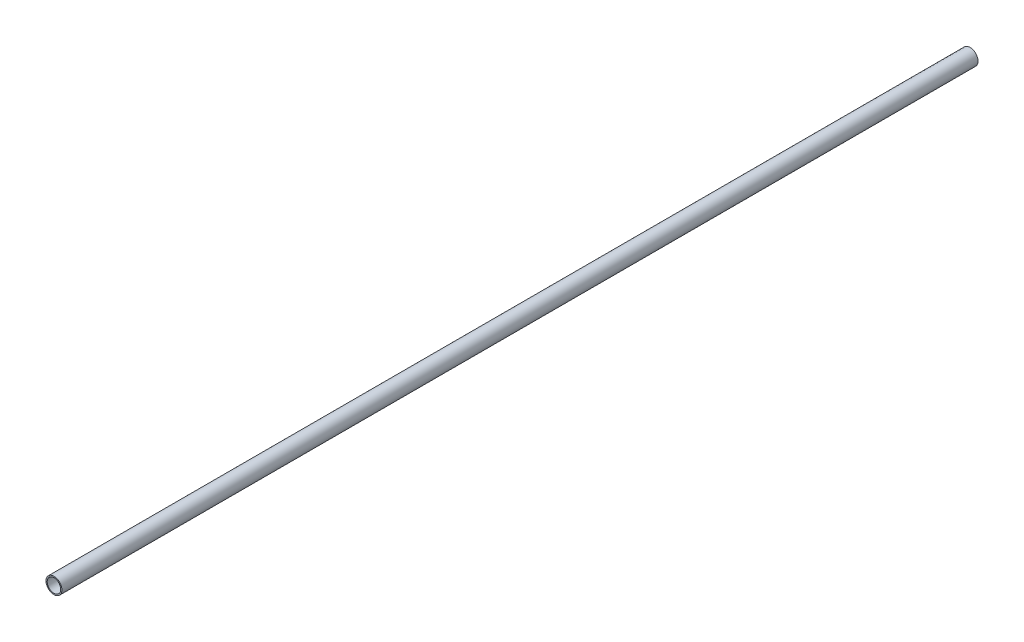
ISO-10303-21;
HEADER;
FILE_DESCRIPTION(('STEP AP214'),'2;1');
FILE_NAME('part.step','',(''),(''),'','','');
FILE_SCHEMA(('AUTOMOTIVE_DESIGN { 1 0 10303 214 1 1 1 1 }'));
ENDSEC;
DATA;
#1=APPLICATION_CONTEXT('core data for automotive mechanical design processes');
#2=APPLICATION_PROTOCOL_DEFINITION('international standard','automotive_design',2000,#1);
#3=PRODUCT_CONTEXT('',#1,'mechanical');
#4=PRODUCT('Part','Part','',(#3));
#5=PRODUCT_RELATED_PRODUCT_CATEGORY('part','',(#4));
#6=PRODUCT_DEFINITION_FORMATION('','',#4);
#7=PRODUCT_DEFINITION_CONTEXT('part definition',#1,'design');
#8=PRODUCT_DEFINITION('design','',#6,#7);
#9=PRODUCT_DEFINITION_SHAPE('','',#8);
#10=(LENGTH_UNIT() NAMED_UNIT(*) SI_UNIT(.MILLI.,.METRE.));
#11=(NAMED_UNIT(*) PLANE_ANGLE_UNIT() SI_UNIT($,.RADIAN.));
#12=(NAMED_UNIT(*) SI_UNIT($,.STERADIAN.) SOLID_ANGLE_UNIT());
#13=UNCERTAINTY_MEASURE_WITH_UNIT(LENGTH_MEASURE(1.E-05),#10,'distance_accuracy_value','');
#14=(GEOMETRIC_REPRESENTATION_CONTEXT(3) GLOBAL_UNCERTAINTY_ASSIGNED_CONTEXT((#13)) GLOBAL_UNIT_ASSIGNED_CONTEXT((#10,
#11,#12)) REPRESENTATION_CONTEXT('',''));
#15=CARTESIAN_POINT('',(0.,0.,0.));
#16=DIRECTION('',(0.,0.,1.));
#17=DIRECTION('',(1.,0.,0.));
#18=AXIS2_PLACEMENT_3D('',#15,#16,#17);
#19=CARTESIAN_POINT('',(0.,0.,1828.8));
#20=DIRECTION('',(0.,0.,1.));
#21=DIRECTION('',(1.,0.,0.));
#22=AXIS2_PLACEMENT_3D('',#19,#20,#21);
#23=PLANE('',#22);
#24=CARTESIAN_POINT('',(0.,0.,1828.8));
#25=DIRECTION('',(0.,0.,1.));
#26=DIRECTION('',(1.,0.,0.));
#27=AXIS2_PLACEMENT_3D('',#24,#25,#26);
#28=CIRCLE('',#27,15.875);
#29=CARTESIAN_POINT('',(-15.875,0.,1828.8));
#30=VERTEX_POINT('',#29);
#31=EDGE_CURVE('E10',#30,#30,#28,.T.);
#32=ORIENTED_EDGE('',*,*,#31,.T.);
#33=EDGE_LOOP('',(#32));
#34=FACE_BOUND('',#33,.T.);
#35=CARTESIAN_POINT('',(0.,0.,1828.8));
#36=DIRECTION('',(0.,0.,1.));
#37=DIRECTION('',(1.,0.,0.));
#38=AXIS2_PLACEMENT_3D('',#35,#36,#37);
#39=CIRCLE('',#38,13.462);
#40=CARTESIAN_POINT('',(-13.462,0.,1828.8));
#41=VERTEX_POINT('',#40);
#42=EDGE_CURVE('E42',#41,#41,#39,.T.);
#43=ORIENTED_EDGE('',*,*,#42,.F.);
#44=EDGE_LOOP('',(#43));
#45=FACE_BOUND('',#44,.T.);
#46=ADVANCED_FACE('F31',(#34,#45),#23,.T.);
#47=CARTESIAN_POINT('',(0.,0.,0.));
#48=DIRECTION('',(0.,0.,1.));
#49=DIRECTION('',(1.,0.,0.));
#50=AXIS2_PLACEMENT_3D('',#47,#48,#49);
#51=PLANE('',#50);
#52=CARTESIAN_POINT('',(0.,0.,0.));
#53=DIRECTION('',(0.,0.,1.));
#54=DIRECTION('',(1.,0.,0.));
#55=AXIS2_PLACEMENT_3D('',#52,#53,#54);
#56=CIRCLE('',#55,15.875);
#57=CARTESIAN_POINT('',(-15.875,0.,-2.22044604925031E-13));
#58=VERTEX_POINT('',#57);
#59=EDGE_CURVE('E35',#58,#58,#56,.T.);
#60=ORIENTED_EDGE('',*,*,#59,.F.);
#61=EDGE_LOOP('',(#60));
#62=FACE_BOUND('',#61,.T.);
#63=CARTESIAN_POINT('',(0.,0.,0.));
#64=DIRECTION('',(0.,0.,1.));
#65=DIRECTION('',(1.,0.,0.));
#66=AXIS2_PLACEMENT_3D('',#63,#64,#65);
#67=CIRCLE('',#66,13.462);
#68=CARTESIAN_POINT('',(-13.462,0.,-2.22044604925031E-13));
#69=VERTEX_POINT('',#68);
#70=EDGE_CURVE('E44',#69,#69,#67,.T.);
#71=ORIENTED_EDGE('',*,*,#70,.T.);
#72=EDGE_LOOP('',(#71));
#73=FACE_BOUND('',#72,.T.);
#74=ADVANCED_FACE('F54',(#62,#73),#51,.F.);
#75=CARTESIAN_POINT('',(0.,0.,1828.8));
#76=DIRECTION('',(0.,0.,-1.));
#77=DIRECTION('',(-1.,0.,0.));
#78=AXIS2_PLACEMENT_3D('',#75,#76,#77);
#79=CYLINDRICAL_SURFACE('',#78,15.875);
#80=CARTESIAN_POINT('',(-15.875,0.,1828.8));
#81=CARTESIAN_POINT('',(-15.875,0.,1809.75));
#82=CARTESIAN_POINT('',(-15.875,0.,1790.7));
#83=CARTESIAN_POINT('',(-15.875,0.,1752.6));
#84=CARTESIAN_POINT('',(-15.875,0.,1733.55));
#85=CARTESIAN_POINT('',(-15.875,0.,1695.45));
#86=CARTESIAN_POINT('',(-15.875,0.,1676.4));
#87=CARTESIAN_POINT('',(-15.875,0.,1638.3));
#88=CARTESIAN_POINT('',(-15.875,0.,1619.25));
#89=CARTESIAN_POINT('',(-15.875,0.,1581.15));
#90=CARTESIAN_POINT('',(-15.875,0.,1562.1));
#91=CARTESIAN_POINT('',(-15.875,0.,1524.));
#92=CARTESIAN_POINT('',(-15.875,0.,1504.95));
#93=CARTESIAN_POINT('',(-15.875,0.,1466.85));
#94=CARTESIAN_POINT('',(-15.875,0.,1447.8));
#95=CARTESIAN_POINT('',(-15.875,0.,1409.7));
#96=CARTESIAN_POINT('',(-15.875,0.,1390.65));
#97=CARTESIAN_POINT('',(-15.875,0.,1352.55));
#98=CARTESIAN_POINT('',(-15.875,0.,1333.5));
#99=CARTESIAN_POINT('',(-15.875,0.,1295.4));
#100=CARTESIAN_POINT('',(-15.875,0.,1276.35));
#101=CARTESIAN_POINT('',(-15.875,0.,1238.25));
#102=CARTESIAN_POINT('',(-15.875,0.,1219.2));
#103=CARTESIAN_POINT('',(-15.875,0.,1181.1));
#104=CARTESIAN_POINT('',(-15.875,0.,1162.05));
#105=CARTESIAN_POINT('',(-15.875,0.,1123.95));
#106=CARTESIAN_POINT('',(-15.875,0.,1104.9));
#107=CARTESIAN_POINT('',(-15.875,0.,1066.8));
#108=CARTESIAN_POINT('',(-15.875,0.,1047.75));
#109=CARTESIAN_POINT('',(-15.875,0.,1009.65));
#110=CARTESIAN_POINT('',(-15.875,0.,990.6));
#111=CARTESIAN_POINT('',(-15.875,0.,952.5));
#112=CARTESIAN_POINT('',(-15.875,0.,933.45));
#113=CARTESIAN_POINT('',(-15.875,0.,895.35));
#114=CARTESIAN_POINT('',(-15.875,0.,876.3));
#115=CARTESIAN_POINT('',(-15.875,0.,838.2));
#116=CARTESIAN_POINT('',(-15.875,0.,819.15));
#117=CARTESIAN_POINT('',(-15.875,0.,781.05));
#118=CARTESIAN_POINT('',(-15.875,0.,762.));
#119=CARTESIAN_POINT('',(-15.875,0.,723.9));
#120=CARTESIAN_POINT('',(-15.875,0.,704.85));
#121=CARTESIAN_POINT('',(-15.875,0.,666.75));
#122=CARTESIAN_POINT('',(-15.875,0.,647.7));
#123=CARTESIAN_POINT('',(-15.875,0.,609.6));
#124=CARTESIAN_POINT('',(-15.875,0.,590.55));
#125=CARTESIAN_POINT('',(-15.875,0.,552.45));
#126=CARTESIAN_POINT('',(-15.875,0.,533.4));
#127=CARTESIAN_POINT('',(-15.875,0.,495.3));
#128=CARTESIAN_POINT('',(-15.875,0.,476.25));
#129=CARTESIAN_POINT('',(-15.875,0.,438.15));
#130=CARTESIAN_POINT('',(-15.875,0.,419.1));
#131=CARTESIAN_POINT('',(-15.875,0.,381.));
#132=CARTESIAN_POINT('',(-15.875,0.,361.95));
#133=CARTESIAN_POINT('',(-15.875,0.,323.85));
#134=CARTESIAN_POINT('',(-15.875,0.,304.8));
#135=CARTESIAN_POINT('',(-15.875,0.,266.7));
#136=CARTESIAN_POINT('',(-15.875,0.,247.65));
#137=CARTESIAN_POINT('',(-15.875,0.,209.55));
#138=CARTESIAN_POINT('',(-15.875,0.,190.5));
#139=CARTESIAN_POINT('',(-15.875,0.,152.4));
#140=CARTESIAN_POINT('',(-15.875,0.,133.35));
#141=CARTESIAN_POINT('',(-15.875,0.,95.2499999999998));
#142=CARTESIAN_POINT('',(-15.875,0.,76.1999999999998));
#143=CARTESIAN_POINT('',(-15.875,0.,38.0999999999998));
#144=CARTESIAN_POINT('',(-15.875,0.,19.0499999999998));
#145=CARTESIAN_POINT('',(-15.875,0.,-2.22044604925031E-13));
#146=B_SPLINE_CURVE_WITH_KNOTS('',3,(#80,#81,#82,#83,#84,#85,#86,#87,#88,#89,#90,#91,#92,#93,
#94,#95,#96,#97,#98,#99,#100,#101,#102,#103,#104,#105,#106,#107,#108,#109,#110,#111,#112,#113,
#114,#115,#116,#117,#118,#119,#120,#121,#122,#123,#124,#125,#126,#127,#128,#129,#130,#131,#132,
#133,#134,#135,#136,#137,#138,#139,#140,#141,#142,#143,#144,#145),.UNSPECIFIED.,.F.,.F.,(4,2,2,
2,2,2,2,2,2,2,2,2,2,2,2,2,2,2,2,2,2,2,2,2,2,2,2,2,2,2,2,2,4),(0.,57.1499999999998,114.3,171.45,
228.6,285.75,342.9,400.05,457.2,514.35,571.5,628.65,685.8,742.95,800.1,857.25,914.4,971.55,
1028.7,1085.85,1143.,1200.15,1257.3,1314.45,1371.6,1428.75,1485.9,1543.05,1600.2,1657.35,1714.5,
1771.65,1828.8),.UNSPECIFIED.);
#147=EDGE_CURVE('BSEAM33',#30,#58,#146,.T.);
#148=ORIENTED_EDGE('',*,*,#31,.F.);
#149=ORIENTED_EDGE('',*,*,#59,.T.);
#150=ORIENTED_EDGE('',*,*,#147,.T.);
#151=ORIENTED_EDGE('',*,*,#147,.F.);
#152=EDGE_LOOP('',(#148,#150,#149,#151));
#153=FACE_BOUND('',#152,.T.);
#154=ADVANCED_FACE('F33',(#153),#79,.T.);
#155=CARTESIAN_POINT('',(0.,0.,1828.8));
#156=DIRECTION('',(0.,0.,-1.));
#157=DIRECTION('',(-1.,0.,0.));
#158=AXIS2_PLACEMENT_3D('',#155,#156,#157);
#159=CYLINDRICAL_SURFACE('',#158,13.462);
#160=CARTESIAN_POINT('',(-13.462,0.,1828.8));
#161=CARTESIAN_POINT('',(-13.462,0.,1809.75));
#162=CARTESIAN_POINT('',(-13.462,0.,1790.7));
#163=CARTESIAN_POINT('',(-13.462,0.,1752.6));
#164=CARTESIAN_POINT('',(-13.462,0.,1733.55));
#165=CARTESIAN_POINT('',(-13.462,0.,1695.45));
#166=CARTESIAN_POINT('',(-13.462,0.,1676.4));
#167=CARTESIAN_POINT('',(-13.462,0.,1638.3));
#168=CARTESIAN_POINT('',(-13.462,0.,1619.25));
#169=CARTESIAN_POINT('',(-13.462,0.,1581.15));
#170=CARTESIAN_POINT('',(-13.462,0.,1562.1));
#171=CARTESIAN_POINT('',(-13.462,0.,1524.));
#172=CARTESIAN_POINT('',(-13.462,0.,1504.95));
#173=CARTESIAN_POINT('',(-13.462,0.,1466.85));
#174=CARTESIAN_POINT('',(-13.462,0.,1447.8));
#175=CARTESIAN_POINT('',(-13.462,0.,1409.7));
#176=CARTESIAN_POINT('',(-13.462,0.,1390.65));
#177=CARTESIAN_POINT('',(-13.462,0.,1352.55));
#178=CARTESIAN_POINT('',(-13.462,0.,1333.5));
#179=CARTESIAN_POINT('',(-13.462,0.,1295.4));
#180=CARTESIAN_POINT('',(-13.462,0.,1276.35));
#181=CARTESIAN_POINT('',(-13.462,0.,1238.25));
#182=CARTESIAN_POINT('',(-13.462,0.,1219.2));
#183=CARTESIAN_POINT('',(-13.462,0.,1181.1));
#184=CARTESIAN_POINT('',(-13.462,0.,1162.05));
#185=CARTESIAN_POINT('',(-13.462,0.,1123.95));
#186=CARTESIAN_POINT('',(-13.462,0.,1104.9));
#187=CARTESIAN_POINT('',(-13.462,0.,1066.8));
#188=CARTESIAN_POINT('',(-13.462,0.,1047.75));
#189=CARTESIAN_POINT('',(-13.462,0.,1009.65));
#190=CARTESIAN_POINT('',(-13.462,0.,990.6));
#191=CARTESIAN_POINT('',(-13.462,0.,952.5));
#192=CARTESIAN_POINT('',(-13.462,0.,933.45));
#193=CARTESIAN_POINT('',(-13.462,0.,895.35));
#194=CARTESIAN_POINT('',(-13.462,0.,876.3));
#195=CARTESIAN_POINT('',(-13.462,0.,838.2));
#196=CARTESIAN_POINT('',(-13.462,0.,819.15));
#197=CARTESIAN_POINT('',(-13.462,0.,781.05));
#198=CARTESIAN_POINT('',(-13.462,0.,762.));
#199=CARTESIAN_POINT('',(-13.462,0.,723.9));
#200=CARTESIAN_POINT('',(-13.462,0.,704.85));
#201=CARTESIAN_POINT('',(-13.462,0.,666.75));
#202=CARTESIAN_POINT('',(-13.462,0.,647.7));
#203=CARTESIAN_POINT('',(-13.462,0.,609.6));
#204=CARTESIAN_POINT('',(-13.462,0.,590.55));
#205=CARTESIAN_POINT('',(-13.462,0.,552.45));
#206=CARTESIAN_POINT('',(-13.462,0.,533.4));
#207=CARTESIAN_POINT('',(-13.462,0.,495.3));
#208=CARTESIAN_POINT('',(-13.462,0.,476.25));
#209=CARTESIAN_POINT('',(-13.462,0.,438.15));
#210=CARTESIAN_POINT('',(-13.462,0.,419.1));
#211=CARTESIAN_POINT('',(-13.462,0.,381.));
#212=CARTESIAN_POINT('',(-13.462,0.,361.95));
#213=CARTESIAN_POINT('',(-13.462,0.,323.85));
#214=CARTESIAN_POINT('',(-13.462,0.,304.8));
#215=CARTESIAN_POINT('',(-13.462,0.,266.7));
#216=CARTESIAN_POINT('',(-13.462,0.,247.65));
#217=CARTESIAN_POINT('',(-13.462,0.,209.55));
#218=CARTESIAN_POINT('',(-13.462,0.,190.5));
#219=CARTESIAN_POINT('',(-13.462,0.,152.4));
#220=CARTESIAN_POINT('',(-13.462,0.,133.35));
#221=CARTESIAN_POINT('',(-13.462,0.,95.2499999999998));
#222=CARTESIAN_POINT('',(-13.462,0.,76.1999999999998));
#223=CARTESIAN_POINT('',(-13.462,0.,38.0999999999998));
#224=CARTESIAN_POINT('',(-13.462,0.,19.0499999999998));
#225=CARTESIAN_POINT('',(-13.462,0.,-2.22044604925031E-13));
#226=B_SPLINE_CURVE_WITH_KNOTS('',3,(#160,#161,#162,#163,#164,#165,#166,#167,#168,#169,#170,
#171,#172,#173,#174,#175,#176,#177,#178,#179,#180,#181,#182,#183,#184,#185,#186,#187,#188,#189,
#190,#191,#192,#193,#194,#195,#196,#197,#198,#199,#200,#201,#202,#203,#204,#205,#206,#207,#208,
#209,#210,#211,#212,#213,#214,#215,#216,#217,#218,#219,#220,#221,#222,#223,#224,#225),
.UNSPECIFIED.,.F.,.F.,(4,2,2,2,2,2,2,2,2,2,2,2,2,2,2,2,2,2,2,2,2,2,2,2,2,2,2,2,2,2,2,2,4),(0.,
57.15,114.3,171.45,228.6,285.75,342.9,400.05,457.2,514.35,571.5,628.65,685.8,742.95,800.1,
857.25,914.4,971.55,1028.7,1085.85,1143.,1200.15,1257.3,1314.45,1371.6,1428.75,1485.9,1543.05,
1600.2,1657.35,1714.5,1771.65,1828.8),.UNSPECIFIED.);
#227=EDGE_CURVE('BSEAM50',#41,#69,#226,.T.);
#228=ORIENTED_EDGE('',*,*,#42,.T.);
#229=ORIENTED_EDGE('',*,*,#70,.F.);
#230=ORIENTED_EDGE('',*,*,#227,.T.);
#231=ORIENTED_EDGE('',*,*,#227,.F.);
#232=EDGE_LOOP('',(#228,#230,#229,#231));
#233=FACE_BOUND('',#232,.T.);
#234=ADVANCED_FACE('F50',(#233),#159,.F.);
#235=CLOSED_SHELL('',(#46,#74,#154,#234));
#236=MANIFOLD_SOLID_BREP('B2',#235);
#237=ADVANCED_BREP_SHAPE_REPRESENTATION('',(#18,#236),#14);
#238=SHAPE_DEFINITION_REPRESENTATION(#9,#237);
ENDSEC;
END-ISO-10303-21;
